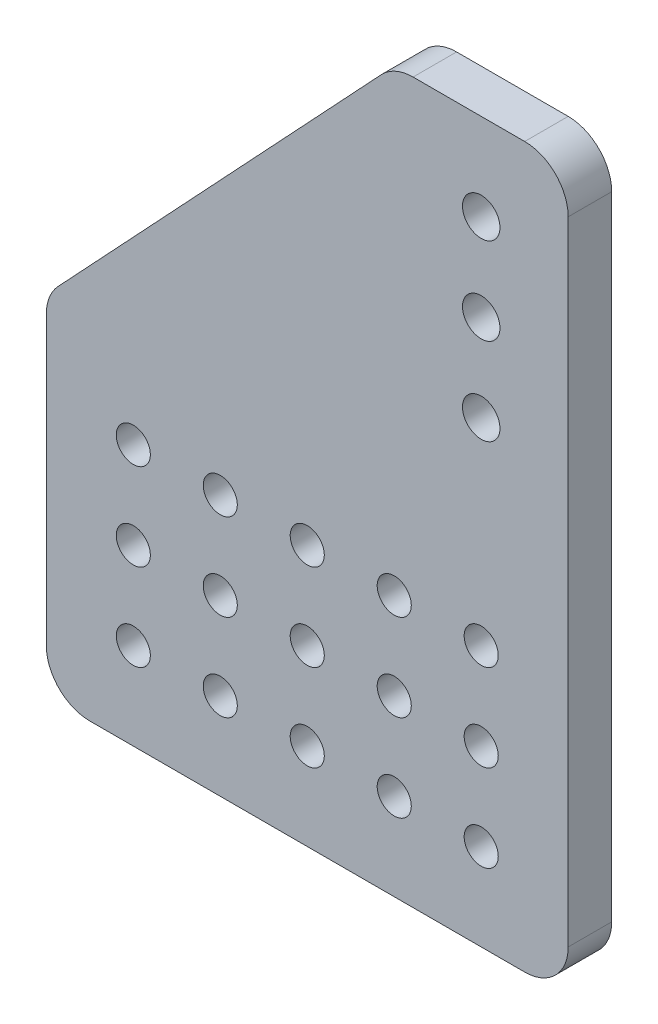
ISO-10303-21;
HEADER;
FILE_DESCRIPTION(('STEP AP214'),'2;1');
FILE_NAME('part.step','',(''),(''),'','','');
FILE_SCHEMA(('AUTOMOTIVE_DESIGN { 1 0 10303 214 1 1 1 1 }'));
ENDSEC;
DATA;
#1=APPLICATION_CONTEXT('core data for automotive mechanical design processes');
#2=APPLICATION_PROTOCOL_DEFINITION('international standard','automotive_design',2000,#1);
#3=PRODUCT_CONTEXT('',#1,'mechanical');
#4=PRODUCT('Part','Part','',(#3));
#5=PRODUCT_RELATED_PRODUCT_CATEGORY('part','',(#4));
#6=PRODUCT_DEFINITION_FORMATION('','',#4);
#7=PRODUCT_DEFINITION_CONTEXT('part definition',#1,'design');
#8=PRODUCT_DEFINITION('design','',#6,#7);
#9=PRODUCT_DEFINITION_SHAPE('','',#8);
#10=(LENGTH_UNIT() NAMED_UNIT(*) SI_UNIT(.MILLI.,.METRE.));
#11=(NAMED_UNIT(*) PLANE_ANGLE_UNIT() SI_UNIT($,.RADIAN.));
#12=(NAMED_UNIT(*) SI_UNIT($,.STERADIAN.) SOLID_ANGLE_UNIT());
#13=UNCERTAINTY_MEASURE_WITH_UNIT(LENGTH_MEASURE(1.E-05),#10,'distance_accuracy_value','');
#14=(GEOMETRIC_REPRESENTATION_CONTEXT(3) GLOBAL_UNCERTAINTY_ASSIGNED_CONTEXT((#13)) GLOBAL_UNIT_ASSIGNED_CONTEXT((#10,
#11,#12)) REPRESENTATION_CONTEXT('',''));
#15=CARTESIAN_POINT('',(0.,0.,0.));
#16=DIRECTION('',(0.,0.,1.));
#17=DIRECTION('',(1.,0.,0.));
#18=AXIS2_PLACEMENT_3D('',#15,#16,#17);
#19=CARTESIAN_POINT('',(-12.7,16.129,-3.175));
#20=DIRECTION('',(0.,0.,1.));
#21=DIRECTION('',(1.,0.,0.));
#22=AXIS2_PLACEMENT_3D('',#19,#20,#21);
#23=CYLINDRICAL_SURFACE('',#22,2.73551732453302);
#24=CARTESIAN_POINT('',(-12.7,16.129,-3.175));
#25=DIRECTION('',(0.,0.,1.));
#26=DIRECTION('',(1.,0.,0.));
#27=AXIS2_PLACEMENT_3D('',#24,#25,#26);
#28=CIRCLE('',#27,2.73551732453302);
#29=CARTESIAN_POINT('',(-9.96448267546698,16.129,-3.175));
#30=VERTEX_POINT('',#29);
#31=EDGE_CURVE('E248',#30,#30,#28,.T.);
#32=ORIENTED_EDGE('',*,*,#31,.F.);
#33=EDGE_LOOP('',(#32));
#34=FACE_BOUND('',#33,.T.);
#35=CARTESIAN_POINT('',(-12.7,16.129,3.175));
#36=DIRECTION('',(0.,0.,1.));
#37=DIRECTION('',(1.,0.,0.));
#38=AXIS2_PLACEMENT_3D('',#35,#36,#37);
#39=CIRCLE('',#38,2.73551732453302);
#40=CARTESIAN_POINT('',(-9.96448267546698,16.129,3.175));
#41=VERTEX_POINT('',#40);
#42=EDGE_CURVE('E251',#41,#41,#39,.T.);
#43=ORIENTED_EDGE('',*,*,#42,.T.);
#44=EDGE_LOOP('',(#43));
#45=FACE_BOUND('',#44,.T.);
#46=ADVANCED_FACE('F43',(#34,#45),#23,.F.);
#47=CARTESIAN_POINT('',(-12.7,28.829,-3.175));
#48=DIRECTION('',(0.,0.,1.));
#49=DIRECTION('',(1.,0.,0.));
#50=AXIS2_PLACEMENT_3D('',#47,#48,#49);
#51=CYLINDRICAL_SURFACE('',#50,2.73551732453302);
#52=CARTESIAN_POINT('',(-12.7,28.829,-3.175));
#53=DIRECTION('',(0.,0.,1.));
#54=DIRECTION('',(1.,0.,0.));
#55=AXIS2_PLACEMENT_3D('',#52,#53,#54);
#56=CIRCLE('',#55,2.73551732453302);
#57=CARTESIAN_POINT('',(-9.96448267546698,28.829,-3.175));
#58=VERTEX_POINT('',#57);
#59=EDGE_CURVE('E242',#58,#58,#56,.T.);
#60=ORIENTED_EDGE('',*,*,#59,.F.);
#61=EDGE_LOOP('',(#60));
#62=FACE_BOUND('',#61,.T.);
#63=CARTESIAN_POINT('',(-12.7,28.829,3.175));
#64=DIRECTION('',(0.,0.,1.));
#65=DIRECTION('',(1.,0.,0.));
#66=AXIS2_PLACEMENT_3D('',#63,#64,#65);
#67=CIRCLE('',#66,2.73551732453302);
#68=CARTESIAN_POINT('',(-9.96448267546698,28.829,3.175));
#69=VERTEX_POINT('',#68);
#70=EDGE_CURVE('E245',#69,#69,#67,.T.);
#71=ORIENTED_EDGE('',*,*,#70,.T.);
#72=EDGE_LOOP('',(#71));
#73=FACE_BOUND('',#72,.T.);
#74=ADVANCED_FACE('F349',(#62,#73),#51,.F.);
#75=CARTESIAN_POINT('',(-63.5,-12.7,-3.175));
#76=DIRECTION('',(0.,0.,1.));
#77=DIRECTION('',(1.,0.,0.));
#78=AXIS2_PLACEMENT_3D('',#75,#76,#77);
#79=CYLINDRICAL_SURFACE('',#78,2.4892);
#80=CARTESIAN_POINT('',(-63.5,-12.7,-3.175));
#81=DIRECTION('',(0.,0.,1.));
#82=DIRECTION('',(1.,0.,0.));
#83=AXIS2_PLACEMENT_3D('',#80,#81,#82);
#84=CIRCLE('',#83,2.4892);
#85=CARTESIAN_POINT('',(-61.0108,-12.7,-3.175));
#86=VERTEX_POINT('',#85);
#87=EDGE_CURVE('E236',#86,#86,#84,.T.);
#88=ORIENTED_EDGE('',*,*,#87,.F.);
#89=EDGE_LOOP('',(#88));
#90=FACE_BOUND('',#89,.T.);
#91=CARTESIAN_POINT('',(-63.5,-12.7,3.175));
#92=DIRECTION('',(0.,0.,1.));
#93=DIRECTION('',(1.,0.,0.));
#94=AXIS2_PLACEMENT_3D('',#91,#92,#93);
#95=CIRCLE('',#94,2.4892);
#96=CARTESIAN_POINT('',(-61.0108,-12.7,3.175));
#97=VERTEX_POINT('',#96);
#98=EDGE_CURVE('E239',#97,#97,#95,.T.);
#99=ORIENTED_EDGE('',*,*,#98,.T.);
#100=EDGE_LOOP('',(#99));
#101=FACE_BOUND('',#100,.T.);
#102=ADVANCED_FACE('F356',(#90,#101),#79,.F.);
#103=CARTESIAN_POINT('',(-50.8,-12.7,-3.175));
#104=DIRECTION('',(0.,0.,1.));
#105=DIRECTION('',(1.,0.,0.));
#106=AXIS2_PLACEMENT_3D('',#103,#104,#105);
#107=CYLINDRICAL_SURFACE('',#106,2.4892);
#108=CARTESIAN_POINT('',(-50.8,-12.7,-3.175));
#109=DIRECTION('',(0.,0.,1.));
#110=DIRECTION('',(1.,0.,0.));
#111=AXIS2_PLACEMENT_3D('',#108,#109,#110);
#112=CIRCLE('',#111,2.4892);
#113=CARTESIAN_POINT('',(-48.3108,-12.7,-3.175));
#114=VERTEX_POINT('',#113);
#115=EDGE_CURVE('E230',#114,#114,#112,.T.);
#116=ORIENTED_EDGE('',*,*,#115,.F.);
#117=EDGE_LOOP('',(#116));
#118=FACE_BOUND('',#117,.T.);
#119=CARTESIAN_POINT('',(-50.8,-12.7,3.175));
#120=DIRECTION('',(0.,0.,1.));
#121=DIRECTION('',(1.,0.,0.));
#122=AXIS2_PLACEMENT_3D('',#119,#120,#121);
#123=CIRCLE('',#122,2.4892);
#124=CARTESIAN_POINT('',(-48.3108,-12.7,3.175));
#125=VERTEX_POINT('',#124);
#126=EDGE_CURVE('E233',#125,#125,#123,.T.);
#127=ORIENTED_EDGE('',*,*,#126,.T.);
#128=EDGE_LOOP('',(#127));
#129=FACE_BOUND('',#128,.T.);
#130=ADVANCED_FACE('F443',(#118,#129),#107,.F.);
#131=CARTESIAN_POINT('',(-38.1,-12.7,-3.175));
#132=DIRECTION('',(0.,0.,1.));
#133=DIRECTION('',(1.,0.,0.));
#134=AXIS2_PLACEMENT_3D('',#131,#132,#133);
#135=CYLINDRICAL_SURFACE('',#134,2.4892);
#136=CARTESIAN_POINT('',(-38.1,-12.7,-3.175));
#137=DIRECTION('',(0.,0.,1.));
#138=DIRECTION('',(1.,0.,0.));
#139=AXIS2_PLACEMENT_3D('',#136,#137,#138);
#140=CIRCLE('',#139,2.4892);
#141=CARTESIAN_POINT('',(-35.6108,-12.7,-3.175));
#142=VERTEX_POINT('',#141);
#143=EDGE_CURVE('E224',#142,#142,#140,.T.);
#144=ORIENTED_EDGE('',*,*,#143,.F.);
#145=EDGE_LOOP('',(#144));
#146=FACE_BOUND('',#145,.T.);
#147=CARTESIAN_POINT('',(-38.1,-12.7,3.175));
#148=DIRECTION('',(0.,0.,1.));
#149=DIRECTION('',(1.,0.,0.));
#150=AXIS2_PLACEMENT_3D('',#147,#148,#149);
#151=CIRCLE('',#150,2.4892);
#152=CARTESIAN_POINT('',(-35.6108,-12.7,3.175));
#153=VERTEX_POINT('',#152);
#154=EDGE_CURVE('E227',#153,#153,#151,.T.);
#155=ORIENTED_EDGE('',*,*,#154,.T.);
#156=EDGE_LOOP('',(#155));
#157=FACE_BOUND('',#156,.T.);
#158=ADVANCED_FACE('F439',(#146,#157),#135,.F.);
#159=CARTESIAN_POINT('',(-25.4,-12.7,-3.175));
#160=DIRECTION('',(0.,0.,1.));
#161=DIRECTION('',(1.,0.,0.));
#162=AXIS2_PLACEMENT_3D('',#159,#160,#161);
#163=CYLINDRICAL_SURFACE('',#162,2.4892);
#164=CARTESIAN_POINT('',(-25.4,-12.7,-3.175));
#165=DIRECTION('',(0.,0.,1.));
#166=DIRECTION('',(1.,0.,0.));
#167=AXIS2_PLACEMENT_3D('',#164,#165,#166);
#168=CIRCLE('',#167,2.4892);
#169=CARTESIAN_POINT('',(-22.9108,-12.7,-3.175));
#170=VERTEX_POINT('',#169);
#171=EDGE_CURVE('E218',#170,#170,#168,.T.);
#172=ORIENTED_EDGE('',*,*,#171,.F.);
#173=EDGE_LOOP('',(#172));
#174=FACE_BOUND('',#173,.T.);
#175=CARTESIAN_POINT('',(-25.4,-12.7,3.175));
#176=DIRECTION('',(0.,0.,1.));
#177=DIRECTION('',(1.,0.,0.));
#178=AXIS2_PLACEMENT_3D('',#175,#176,#177);
#179=CIRCLE('',#178,2.4892);
#180=CARTESIAN_POINT('',(-22.9108,-12.7,3.175));
#181=VERTEX_POINT('',#180);
#182=EDGE_CURVE('E221',#181,#181,#179,.T.);
#183=ORIENTED_EDGE('',*,*,#182,.T.);
#184=EDGE_LOOP('',(#183));
#185=FACE_BOUND('',#184,.T.);
#186=ADVANCED_FACE('F435',(#174,#185),#163,.F.);
#187=CARTESIAN_POINT('',(-12.7,-12.7,-3.175));
#188=DIRECTION('',(0.,0.,1.));
#189=DIRECTION('',(1.,0.,0.));
#190=AXIS2_PLACEMENT_3D('',#187,#188,#189);
#191=CYLINDRICAL_SURFACE('',#190,2.4892);
#192=CARTESIAN_POINT('',(-12.7,-12.7,-3.175));
#193=DIRECTION('',(0.,0.,1.));
#194=DIRECTION('',(1.,0.,0.));
#195=AXIS2_PLACEMENT_3D('',#192,#193,#194);
#196=CIRCLE('',#195,2.4892);
#197=CARTESIAN_POINT('',(-10.2108,-12.7,-3.175));
#198=VERTEX_POINT('',#197);
#199=EDGE_CURVE('E212',#198,#198,#196,.T.);
#200=ORIENTED_EDGE('',*,*,#199,.F.);
#201=EDGE_LOOP('',(#200));
#202=FACE_BOUND('',#201,.T.);
#203=CARTESIAN_POINT('',(-12.7,-12.7,3.175));
#204=DIRECTION('',(0.,0.,1.));
#205=DIRECTION('',(1.,0.,0.));
#206=AXIS2_PLACEMENT_3D('',#203,#204,#205);
#207=CIRCLE('',#206,2.4892);
#208=CARTESIAN_POINT('',(-10.2108,-12.7,3.175));
#209=VERTEX_POINT('',#208);
#210=EDGE_CURVE('E215',#209,#209,#207,.T.);
#211=ORIENTED_EDGE('',*,*,#210,.T.);
#212=EDGE_LOOP('',(#211));
#213=FACE_BOUND('',#212,.T.);
#214=ADVANCED_FACE('F431',(#202,#213),#191,.F.);
#215=CARTESIAN_POINT('',(-63.5,-25.4,-3.175));
#216=DIRECTION('',(0.,0.,1.));
#217=DIRECTION('',(1.,0.,0.));
#218=AXIS2_PLACEMENT_3D('',#215,#216,#217);
#219=CYLINDRICAL_SURFACE('',#218,2.4892);
#220=CARTESIAN_POINT('',(-63.5,-25.4,-3.175));
#221=DIRECTION('',(0.,0.,1.));
#222=DIRECTION('',(1.,0.,0.));
#223=AXIS2_PLACEMENT_3D('',#220,#221,#222);
#224=CIRCLE('',#223,2.4892);
#225=CARTESIAN_POINT('',(-61.0108,-25.4,-3.175));
#226=VERTEX_POINT('',#225);
#227=EDGE_CURVE('E206',#226,#226,#224,.T.);
#228=ORIENTED_EDGE('',*,*,#227,.F.);
#229=EDGE_LOOP('',(#228));
#230=FACE_BOUND('',#229,.T.);
#231=CARTESIAN_POINT('',(-63.5,-25.4,3.175));
#232=DIRECTION('',(0.,0.,1.));
#233=DIRECTION('',(1.,0.,0.));
#234=AXIS2_PLACEMENT_3D('',#231,#232,#233);
#235=CIRCLE('',#234,2.4892);
#236=CARTESIAN_POINT('',(-61.0108,-25.4,3.175));
#237=VERTEX_POINT('',#236);
#238=EDGE_CURVE('E209',#237,#237,#235,.T.);
#239=ORIENTED_EDGE('',*,*,#238,.T.);
#240=EDGE_LOOP('',(#239));
#241=FACE_BOUND('',#240,.T.);
#242=ADVANCED_FACE('F427',(#230,#241),#219,.F.);
#243=CARTESIAN_POINT('',(-50.8,-25.4,-3.175));
#244=DIRECTION('',(0.,0.,1.));
#245=DIRECTION('',(1.,0.,0.));
#246=AXIS2_PLACEMENT_3D('',#243,#244,#245);
#247=CYLINDRICAL_SURFACE('',#246,2.4892);
#248=CARTESIAN_POINT('',(-50.8,-25.4,-3.175));
#249=DIRECTION('',(0.,0.,1.));
#250=DIRECTION('',(1.,0.,0.));
#251=AXIS2_PLACEMENT_3D('',#248,#249,#250);
#252=CIRCLE('',#251,2.4892);
#253=CARTESIAN_POINT('',(-48.3108,-25.4,-3.175));
#254=VERTEX_POINT('',#253);
#255=EDGE_CURVE('E200',#254,#254,#252,.T.);
#256=ORIENTED_EDGE('',*,*,#255,.F.);
#257=EDGE_LOOP('',(#256));
#258=FACE_BOUND('',#257,.T.);
#259=CARTESIAN_POINT('',(-50.8,-25.4,3.175));
#260=DIRECTION('',(0.,0.,1.));
#261=DIRECTION('',(1.,0.,0.));
#262=AXIS2_PLACEMENT_3D('',#259,#260,#261);
#263=CIRCLE('',#262,2.4892);
#264=CARTESIAN_POINT('',(-48.3108,-25.4,3.175));
#265=VERTEX_POINT('',#264);
#266=EDGE_CURVE('E203',#265,#265,#263,.T.);
#267=ORIENTED_EDGE('',*,*,#266,.T.);
#268=EDGE_LOOP('',(#267));
#269=FACE_BOUND('',#268,.T.);
#270=ADVANCED_FACE('F423',(#258,#269),#247,.F.);
#271=CARTESIAN_POINT('',(-38.1,-25.4,-3.175));
#272=DIRECTION('',(0.,0.,1.));
#273=DIRECTION('',(1.,0.,0.));
#274=AXIS2_PLACEMENT_3D('',#271,#272,#273);
#275=CYLINDRICAL_SURFACE('',#274,2.4892);
#276=CARTESIAN_POINT('',(-38.1,-25.4,-3.175));
#277=DIRECTION('',(0.,0.,1.));
#278=DIRECTION('',(1.,0.,0.));
#279=AXIS2_PLACEMENT_3D('',#276,#277,#278);
#280=CIRCLE('',#279,2.4892);
#281=CARTESIAN_POINT('',(-35.6108,-25.4,-3.175));
#282=VERTEX_POINT('',#281);
#283=EDGE_CURVE('E194',#282,#282,#280,.T.);
#284=ORIENTED_EDGE('',*,*,#283,.F.);
#285=EDGE_LOOP('',(#284));
#286=FACE_BOUND('',#285,.T.);
#287=CARTESIAN_POINT('',(-38.1,-25.4,3.175));
#288=DIRECTION('',(0.,0.,1.));
#289=DIRECTION('',(1.,0.,0.));
#290=AXIS2_PLACEMENT_3D('',#287,#288,#289);
#291=CIRCLE('',#290,2.4892);
#292=CARTESIAN_POINT('',(-35.6108,-25.4,3.175));
#293=VERTEX_POINT('',#292);
#294=EDGE_CURVE('E197',#293,#293,#291,.T.);
#295=ORIENTED_EDGE('',*,*,#294,.T.);
#296=EDGE_LOOP('',(#295));
#297=FACE_BOUND('',#296,.T.);
#298=ADVANCED_FACE('F419',(#286,#297),#275,.F.);
#299=CARTESIAN_POINT('',(-25.4,-25.4,-3.175));
#300=DIRECTION('',(0.,0.,1.));
#301=DIRECTION('',(1.,0.,0.));
#302=AXIS2_PLACEMENT_3D('',#299,#300,#301);
#303=CYLINDRICAL_SURFACE('',#302,2.4892);
#304=CARTESIAN_POINT('',(-25.4,-25.4,-3.175));
#305=DIRECTION('',(0.,0.,1.));
#306=DIRECTION('',(1.,0.,0.));
#307=AXIS2_PLACEMENT_3D('',#304,#305,#306);
#308=CIRCLE('',#307,2.4892);
#309=CARTESIAN_POINT('',(-22.9108,-25.4,-3.175));
#310=VERTEX_POINT('',#309);
#311=EDGE_CURVE('E188',#310,#310,#308,.T.);
#312=ORIENTED_EDGE('',*,*,#311,.F.);
#313=EDGE_LOOP('',(#312));
#314=FACE_BOUND('',#313,.T.);
#315=CARTESIAN_POINT('',(-25.4,-25.4,3.175));
#316=DIRECTION('',(0.,0.,1.));
#317=DIRECTION('',(1.,0.,0.));
#318=AXIS2_PLACEMENT_3D('',#315,#316,#317);
#319=CIRCLE('',#318,2.4892);
#320=CARTESIAN_POINT('',(-22.9108,-25.4,3.175));
#321=VERTEX_POINT('',#320);
#322=EDGE_CURVE('E191',#321,#321,#319,.T.);
#323=ORIENTED_EDGE('',*,*,#322,.T.);
#324=EDGE_LOOP('',(#323));
#325=FACE_BOUND('',#324,.T.);
#326=ADVANCED_FACE('F415',(#314,#325),#303,.F.);
#327=CARTESIAN_POINT('',(-12.7,-25.4,-3.175));
#328=DIRECTION('',(0.,0.,1.));
#329=DIRECTION('',(1.,0.,0.));
#330=AXIS2_PLACEMENT_3D('',#327,#328,#329);
#331=CYLINDRICAL_SURFACE('',#330,2.4892);
#332=CARTESIAN_POINT('',(-12.7,-25.4,-3.175));
#333=DIRECTION('',(0.,0.,1.));
#334=DIRECTION('',(1.,0.,0.));
#335=AXIS2_PLACEMENT_3D('',#332,#333,#334);
#336=CIRCLE('',#335,2.4892);
#337=CARTESIAN_POINT('',(-10.2108,-25.4,-3.175));
#338=VERTEX_POINT('',#337);
#339=EDGE_CURVE('E182',#338,#338,#336,.T.);
#340=ORIENTED_EDGE('',*,*,#339,.F.);
#341=EDGE_LOOP('',(#340));
#342=FACE_BOUND('',#341,.T.);
#343=CARTESIAN_POINT('',(-12.7,-25.4,3.175));
#344=DIRECTION('',(0.,0.,1.));
#345=DIRECTION('',(1.,0.,0.));
#346=AXIS2_PLACEMENT_3D('',#343,#344,#345);
#347=CIRCLE('',#346,2.4892);
#348=CARTESIAN_POINT('',(-10.2108,-25.4,3.175));
#349=VERTEX_POINT('',#348);
#350=EDGE_CURVE('E185',#349,#349,#347,.T.);
#351=ORIENTED_EDGE('',*,*,#350,.T.);
#352=EDGE_LOOP('',(#351));
#353=FACE_BOUND('',#352,.T.);
#354=ADVANCED_FACE('F411',(#342,#353),#331,.F.);
#355=CARTESIAN_POINT('',(-63.5,-38.1,-3.175));
#356=DIRECTION('',(0.,0.,1.));
#357=DIRECTION('',(1.,0.,0.));
#358=AXIS2_PLACEMENT_3D('',#355,#356,#357);
#359=CYLINDRICAL_SURFACE('',#358,2.4892);
#360=CARTESIAN_POINT('',(-63.5,-38.1,-3.175));
#361=DIRECTION('',(0.,0.,1.));
#362=DIRECTION('',(1.,0.,0.));
#363=AXIS2_PLACEMENT_3D('',#360,#361,#362);
#364=CIRCLE('',#363,2.4892);
#365=CARTESIAN_POINT('',(-61.0108,-38.1,-3.175));
#366=VERTEX_POINT('',#365);
#367=EDGE_CURVE('E176',#366,#366,#364,.T.);
#368=ORIENTED_EDGE('',*,*,#367,.F.);
#369=EDGE_LOOP('',(#368));
#370=FACE_BOUND('',#369,.T.);
#371=CARTESIAN_POINT('',(-63.5,-38.1,3.175));
#372=DIRECTION('',(0.,0.,1.));
#373=DIRECTION('',(1.,0.,0.));
#374=AXIS2_PLACEMENT_3D('',#371,#372,#373);
#375=CIRCLE('',#374,2.4892);
#376=CARTESIAN_POINT('',(-61.0108,-38.1,3.175));
#377=VERTEX_POINT('',#376);
#378=EDGE_CURVE('E179',#377,#377,#375,.T.);
#379=ORIENTED_EDGE('',*,*,#378,.T.);
#380=EDGE_LOOP('',(#379));
#381=FACE_BOUND('',#380,.T.);
#382=ADVANCED_FACE('F407',(#370,#381),#359,.F.);
#383=CARTESIAN_POINT('',(-50.8,-38.1,-3.175));
#384=DIRECTION('',(0.,0.,1.));
#385=DIRECTION('',(1.,0.,0.));
#386=AXIS2_PLACEMENT_3D('',#383,#384,#385);
#387=CYLINDRICAL_SURFACE('',#386,2.4892);
#388=CARTESIAN_POINT('',(-50.8,-38.1,-3.175));
#389=DIRECTION('',(0.,0.,1.));
#390=DIRECTION('',(1.,0.,0.));
#391=AXIS2_PLACEMENT_3D('',#388,#389,#390);
#392=CIRCLE('',#391,2.4892);
#393=CARTESIAN_POINT('',(-48.3108,-38.1,-3.175));
#394=VERTEX_POINT('',#393);
#395=EDGE_CURVE('E170',#394,#394,#392,.T.);
#396=ORIENTED_EDGE('',*,*,#395,.F.);
#397=EDGE_LOOP('',(#396));
#398=FACE_BOUND('',#397,.T.);
#399=CARTESIAN_POINT('',(-50.8,-38.1,3.175));
#400=DIRECTION('',(0.,0.,1.));
#401=DIRECTION('',(1.,0.,0.));
#402=AXIS2_PLACEMENT_3D('',#399,#400,#401);
#403=CIRCLE('',#402,2.4892);
#404=CARTESIAN_POINT('',(-48.3108,-38.1,3.175));
#405=VERTEX_POINT('',#404);
#406=EDGE_CURVE('E173',#405,#405,#403,.T.);
#407=ORIENTED_EDGE('',*,*,#406,.T.);
#408=EDGE_LOOP('',(#407));
#409=FACE_BOUND('',#408,.T.);
#410=ADVANCED_FACE('F403',(#398,#409),#387,.F.);
#411=CARTESIAN_POINT('',(-38.1,-38.1,-3.175));
#412=DIRECTION('',(0.,0.,1.));
#413=DIRECTION('',(1.,0.,0.));
#414=AXIS2_PLACEMENT_3D('',#411,#412,#413);
#415=CYLINDRICAL_SURFACE('',#414,2.4892);
#416=CARTESIAN_POINT('',(-38.1,-38.1,-3.175));
#417=DIRECTION('',(0.,0.,1.));
#418=DIRECTION('',(1.,0.,0.));
#419=AXIS2_PLACEMENT_3D('',#416,#417,#418);
#420=CIRCLE('',#419,2.4892);
#421=CARTESIAN_POINT('',(-35.6108,-38.1,-3.175));
#422=VERTEX_POINT('',#421);
#423=EDGE_CURVE('E164',#422,#422,#420,.T.);
#424=ORIENTED_EDGE('',*,*,#423,.F.);
#425=EDGE_LOOP('',(#424));
#426=FACE_BOUND('',#425,.T.);
#427=CARTESIAN_POINT('',(-38.1,-38.1,3.175));
#428=DIRECTION('',(0.,0.,1.));
#429=DIRECTION('',(1.,0.,0.));
#430=AXIS2_PLACEMENT_3D('',#427,#428,#429);
#431=CIRCLE('',#430,2.4892);
#432=CARTESIAN_POINT('',(-35.6108,-38.1,3.175));
#433=VERTEX_POINT('',#432);
#434=EDGE_CURVE('E167',#433,#433,#431,.T.);
#435=ORIENTED_EDGE('',*,*,#434,.T.);
#436=EDGE_LOOP('',(#435));
#437=FACE_BOUND('',#436,.T.);
#438=ADVANCED_FACE('F399',(#426,#437),#415,.F.);
#439=CARTESIAN_POINT('',(-25.4,-38.1,-3.175));
#440=DIRECTION('',(0.,0.,1.));
#441=DIRECTION('',(1.,0.,0.));
#442=AXIS2_PLACEMENT_3D('',#439,#440,#441);
#443=CYLINDRICAL_SURFACE('',#442,2.4892);
#444=CARTESIAN_POINT('',(-25.4,-38.1,-3.175));
#445=DIRECTION('',(0.,0.,1.));
#446=DIRECTION('',(1.,0.,0.));
#447=AXIS2_PLACEMENT_3D('',#444,#445,#446);
#448=CIRCLE('',#447,2.4892);
#449=CARTESIAN_POINT('',(-22.9108,-38.1,-3.175));
#450=VERTEX_POINT('',#449);
#451=EDGE_CURVE('E157',#450,#450,#448,.T.);
#452=ORIENTED_EDGE('',*,*,#451,.F.);
#453=EDGE_LOOP('',(#452));
#454=FACE_BOUND('',#453,.T.);
#455=CARTESIAN_POINT('',(-25.4,-38.1,3.175));
#456=DIRECTION('',(0.,0.,1.));
#457=DIRECTION('',(1.,0.,0.));
#458=AXIS2_PLACEMENT_3D('',#455,#456,#457);
#459=CIRCLE('',#458,2.4892);
#460=CARTESIAN_POINT('',(-22.9108,-38.1,3.175));
#461=VERTEX_POINT('',#460);
#462=EDGE_CURVE('E160',#461,#461,#459,.T.);
#463=ORIENTED_EDGE('',*,*,#462,.T.);
#464=EDGE_LOOP('',(#463));
#465=FACE_BOUND('',#464,.T.);
#466=ADVANCED_FACE('F397',(#454,#465),#443,.F.);
#467=CARTESIAN_POINT('',(0.,54.229,3.175));
#468=DIRECTION('',(0.,-1.,0.));
#469=DIRECTION('',(1.,0.,0.));
#470=AXIS2_PLACEMENT_3D('',#467,#468,#469);
#471=PLANE('',#470);
#472=DIRECTION('',(-1.,0.,0.));
#473=VECTOR('',#472,1.);
#474=CARTESIAN_POINT('',(0.,54.229,3.175));
#475=LINE('',#474,#473);
#476=CARTESIAN_POINT('',(-6.35,54.229,3.175));
#477=VERTEX_POINT('',#476);
#478=CARTESIAN_POINT('',(-22.6475072562806,54.229,3.175));
#479=VERTEX_POINT('',#478);
#480=EDGE_CURVE('E151',#477,#479,#475,.T.);
#481=ORIENTED_EDGE('',*,*,#480,.F.);
#482=DIRECTION('',(0.,0.,-1.));
#483=VECTOR('',#482,1.);
#484=CARTESIAN_POINT('',(-6.35,54.229,3.175));
#485=LINE('',#484,#483);
#486=CARTESIAN_POINT('',(-6.35,54.229,-3.175));
#487=VERTEX_POINT('',#486);
#488=EDGE_CURVE('E11',#477,#487,#485,.T.);
#489=ORIENTED_EDGE('',*,*,#488,.T.);
#490=DIRECTION('',(-1.,0.,0.));
#491=VECTOR('',#490,1.);
#492=CARTESIAN_POINT('',(0.,54.229,-3.175));
#493=LINE('',#492,#491);
#494=CARTESIAN_POINT('',(-22.6475072562806,54.229,-3.175));
#495=VERTEX_POINT('',#494);
#496=EDGE_CURVE('E287',#487,#495,#493,.T.);
#497=ORIENTED_EDGE('',*,*,#496,.T.);
#498=DIRECTION('',(0.,0.,-1.));
#499=VECTOR('',#498,1.);
#500=CARTESIAN_POINT('',(-22.6475072562806,54.229,3.175));
#501=LINE('',#500,#499);
#502=EDGE_CURVE('E51',#495,#479,#501,.F.);
#503=ORIENTED_EDGE('',*,*,#502,.T.);
#504=EDGE_LOOP('',(#481,#489,#497,#503));
#505=FACE_BOUND('',#504,.T.);
#506=ADVANCED_FACE('F285',(#505),#471,.F.);
#507=CARTESIAN_POINT('',(-76.2,0.,3.175));
#508=DIRECTION('',(0.72980364699567,-0.68365681217393,0.));
#509=DIRECTION('',(0.68365681217393,0.72980364699567,0.));
#510=AXIS2_PLACEMENT_3D('',#507,#508,#509);
#511=PLANE('',#510);
#512=DIRECTION('',(-0.68365681217393,-0.72980364699567,0.));
#513=VECTOR('',#512,1.);
#514=CARTESIAN_POINT('',(-76.2,0.,-3.175));
#515=LINE('',#514,#513);
#516=CARTESIAN_POINT('',(-27.2817604147031,52.2202207573045,-3.175));
#517=VERTEX_POINT('',#516);
#518=CARTESIAN_POINT('',(-74.4842531584225,1.83155975338396,-3.175));
#519=VERTEX_POINT('',#518);
#520=EDGE_CURVE('E301',#517,#519,#515,.T.);
#521=ORIENTED_EDGE('',*,*,#520,.T.);
#522=DIRECTION('',(0.,0.,-1.));
#523=VECTOR('',#522,1.);
#524=CARTESIAN_POINT('',(-74.4842531584225,1.83155975338396,3.175));
#525=LINE('',#524,#523);
#526=CARTESIAN_POINT('',(-74.4842531584225,1.83155975338396,3.175));
#527=VERTEX_POINT('',#526);
#528=EDGE_CURVE('E279',#519,#527,#525,.F.);
#529=ORIENTED_EDGE('',*,*,#528,.T.);
#530=DIRECTION('',(-0.68365681217393,-0.72980364699567,0.));
#531=VECTOR('',#530,1.);
#532=CARTESIAN_POINT('',(-76.2,0.,3.175));
#533=LINE('',#532,#531);
#534=CARTESIAN_POINT('',(-27.2817604147031,52.2202207573045,3.175));
#535=VERTEX_POINT('',#534);
#536=EDGE_CURVE('E294',#535,#527,#533,.T.);
#537=ORIENTED_EDGE('',*,*,#536,.F.);
#538=DIRECTION('',(0.,0.,-1.));
#539=VECTOR('',#538,1.);
#540=CARTESIAN_POINT('',(-27.2817604147031,52.2202207573045,3.175));
#541=LINE('',#540,#539);
#542=EDGE_CURVE('E276',#535,#517,#541,.T.);
#543=ORIENTED_EDGE('',*,*,#542,.T.);
#544=EDGE_LOOP('',(#521,#529,#537,#543));
#545=FACE_BOUND('',#544,.T.);
#546=ADVANCED_FACE('F300',(#545),#511,.F.);
#547=CARTESIAN_POINT('',(-76.2,0.,3.175));
#548=DIRECTION('',(1.,0.,0.));
#549=DIRECTION('',(0.,1.,0.));
#550=AXIS2_PLACEMENT_3D('',#547,#548,#549);
#551=PLANE('',#550);
#552=DIRECTION('',(0.,-1.,0.));
#553=VECTOR('',#552,1.);
#554=CARTESIAN_POINT('',(-76.2,0.,-3.175));
#555=LINE('',#554,#553);
#556=CARTESIAN_POINT('',(-76.2,-2.50966100392049,-3.175));
#557=VERTEX_POINT('',#556);
#558=CARTESIAN_POINT('',(-76.2,-44.45,-3.175));
#559=VERTEX_POINT('',#558);
#560=EDGE_CURVE('E153',#557,#559,#555,.T.);
#561=ORIENTED_EDGE('',*,*,#560,.T.);
#562=DIRECTION('',(0.,0.,-1.));
#563=VECTOR('',#562,1.);
#564=CARTESIAN_POINT('',(-76.2,-44.45,3.175));
#565=LINE('',#564,#563);
#566=CARTESIAN_POINT('',(-76.2,-44.45,3.175));
#567=VERTEX_POINT('',#566);
#568=EDGE_CURVE('E58',#559,#567,#565,.F.);
#569=ORIENTED_EDGE('',*,*,#568,.T.);
#570=DIRECTION('',(0.,-1.,0.));
#571=VECTOR('',#570,1.);
#572=CARTESIAN_POINT('',(-76.2,0.,3.175));
#573=LINE('',#572,#571);
#574=CARTESIAN_POINT('',(-76.2,-2.50966100392049,3.175));
#575=VERTEX_POINT('',#574);
#576=EDGE_CURVE('E309',#575,#567,#573,.T.);
#577=ORIENTED_EDGE('',*,*,#576,.F.);
#578=DIRECTION('',(0.,0.,-1.));
#579=VECTOR('',#578,1.);
#580=CARTESIAN_POINT('',(-76.2,-2.50966100392049,3.175));
#581=LINE('',#580,#579);
#582=EDGE_CURVE('E272',#575,#557,#581,.T.);
#583=ORIENTED_EDGE('',*,*,#582,.T.);
#584=EDGE_LOOP('',(#561,#569,#577,#583));
#585=FACE_BOUND('',#584,.T.);
#586=ADVANCED_FACE('F383',(#585),#551,.F.);
#587=CARTESIAN_POINT('',(0.,-50.8,3.175));
#588=DIRECTION('',(0.,1.,0.));
#589=DIRECTION('',(-1.,0.,0.));
#590=AXIS2_PLACEMENT_3D('',#587,#588,#589);
#591=PLANE('',#590);
#592=DIRECTION('',(1.,0.,0.));
#593=VECTOR('',#592,1.);
#594=CARTESIAN_POINT('',(0.,-50.8,-3.175));
#595=LINE('',#594,#593);
#596=CARTESIAN_POINT('',(-69.85,-50.8,-3.175));
#597=VERTEX_POINT('',#596);
#598=CARTESIAN_POINT('',(-6.35,-50.8,-3.175));
#599=VERTEX_POINT('',#598);
#600=EDGE_CURVE('E149',#597,#599,#595,.T.);
#601=ORIENTED_EDGE('',*,*,#600,.T.);
#602=DIRECTION('',(0.,0.,-1.));
#603=VECTOR('',#602,1.);
#604=CARTESIAN_POINT('',(-6.35,-50.8,3.175));
#605=LINE('',#604,#603);
#606=CARTESIAN_POINT('',(-6.35,-50.8,3.175));
#607=VERTEX_POINT('',#606);
#608=EDGE_CURVE('E127',#599,#607,#605,.F.);
#609=ORIENTED_EDGE('',*,*,#608,.T.);
#610=DIRECTION('',(1.,0.,0.));
#611=VECTOR('',#610,1.);
#612=CARTESIAN_POINT('',(0.,-50.8,3.175));
#613=LINE('',#612,#611);
#614=CARTESIAN_POINT('',(-69.85,-50.8,3.175));
#615=VERTEX_POINT('',#614);
#616=EDGE_CURVE('E161',#615,#607,#613,.T.);
#617=ORIENTED_EDGE('',*,*,#616,.F.);
#618=DIRECTION('',(0.,0.,-1.));
#619=VECTOR('',#618,1.);
#620=CARTESIAN_POINT('',(-69.85,-50.8,3.175));
#621=LINE('',#620,#619);
#622=EDGE_CURVE('E132',#615,#597,#621,.T.);
#623=ORIENTED_EDGE('',*,*,#622,.T.);
#624=EDGE_LOOP('',(#601,#609,#617,#623));
#625=FACE_BOUND('',#624,.T.);
#626=ADVANCED_FACE('F382',(#625),#591,.F.);
#627=CARTESIAN_POINT('',(0.,0.,3.175));
#628=DIRECTION('',(-1.,0.,0.));
#629=DIRECTION('',(0.,0.,1.));
#630=AXIS2_PLACEMENT_3D('',#627,#628,#629);
#631=PLANE('',#630);
#632=DIRECTION('',(0.,1.,0.));
#633=VECTOR('',#632,1.);
#634=CARTESIAN_POINT('',(0.,3.429,3.175));
#635=LINE('',#634,#633);
#636=CARTESIAN_POINT('',(0.,-44.45,3.175));
#637=VERTEX_POINT('',#636);
#638=CARTESIAN_POINT('',(0.,47.879,3.175));
#639=VERTEX_POINT('',#638);
#640=EDGE_CURVE('E142',#637,#639,#635,.T.);
#641=ORIENTED_EDGE('',*,*,#640,.F.);
#642=DIRECTION('',(0.,0.,-1.));
#643=VECTOR('',#642,1.);
#644=CARTESIAN_POINT('',(0.,-44.45,3.175));
#645=LINE('',#644,#643);
#646=CARTESIAN_POINT('',(0.,-44.45,-3.175));
#647=VERTEX_POINT('',#646);
#648=EDGE_CURVE('E126',#637,#647,#645,.T.);
#649=ORIENTED_EDGE('',*,*,#648,.T.);
#650=DIRECTION('',(0.,1.,0.));
#651=VECTOR('',#650,1.);
#652=CARTESIAN_POINT('',(0.,0.,-3.175));
#653=LINE('',#652,#651);
#654=CARTESIAN_POINT('',(0.,47.879,-3.175));
#655=VERTEX_POINT('',#654);
#656=EDGE_CURVE('E139',#647,#655,#653,.T.);
#657=ORIENTED_EDGE('',*,*,#656,.T.);
#658=DIRECTION('',(0.,0.,-1.));
#659=VECTOR('',#658,1.);
#660=CARTESIAN_POINT('',(0.,47.879,3.175));
#661=LINE('',#660,#659);
#662=EDGE_CURVE('E144',#655,#639,#661,.F.);
#663=ORIENTED_EDGE('',*,*,#662,.T.);
#664=EDGE_LOOP('',(#641,#649,#657,#663));
#665=FACE_BOUND('',#664,.T.);
#666=ADVANCED_FACE('F138',(#665),#631,.F.);
#667=CARTESIAN_POINT('',(0.,0.,3.175));
#668=DIRECTION('',(0.,0.,-1.));
#669=DIRECTION('',(-1.,0.,0.));
#670=AXIS2_PLACEMENT_3D('',#667,#668,#669);
#671=PLANE('',#670);
#672=ORIENTED_EDGE('',*,*,#42,.F.);
#673=EDGE_LOOP('',(#672));
#674=FACE_BOUND('',#673,.T.);
#675=ORIENTED_EDGE('',*,*,#70,.F.);
#676=EDGE_LOOP('',(#675));
#677=FACE_BOUND('',#676,.T.);
#678=ORIENTED_EDGE('',*,*,#98,.F.);
#679=EDGE_LOOP('',(#678));
#680=FACE_BOUND('',#679,.T.);
#681=ORIENTED_EDGE('',*,*,#126,.F.);
#682=EDGE_LOOP('',(#681));
#683=FACE_BOUND('',#682,.T.);
#684=ORIENTED_EDGE('',*,*,#154,.F.);
#685=EDGE_LOOP('',(#684));
#686=FACE_BOUND('',#685,.T.);
#687=ORIENTED_EDGE('',*,*,#182,.F.);
#688=EDGE_LOOP('',(#687));
#689=FACE_BOUND('',#688,.T.);
#690=ORIENTED_EDGE('',*,*,#210,.F.);
#691=EDGE_LOOP('',(#690));
#692=FACE_BOUND('',#691,.T.);
#693=ORIENTED_EDGE('',*,*,#238,.F.);
#694=EDGE_LOOP('',(#693));
#695=FACE_BOUND('',#694,.T.);
#696=ORIENTED_EDGE('',*,*,#266,.F.);
#697=EDGE_LOOP('',(#696));
#698=FACE_BOUND('',#697,.T.);
#699=ORIENTED_EDGE('',*,*,#294,.F.);
#700=EDGE_LOOP('',(#699));
#701=FACE_BOUND('',#700,.T.);
#702=ORIENTED_EDGE('',*,*,#322,.F.);
#703=EDGE_LOOP('',(#702));
#704=FACE_BOUND('',#703,.T.);
#705=ORIENTED_EDGE('',*,*,#350,.F.);
#706=EDGE_LOOP('',(#705));
#707=FACE_BOUND('',#706,.T.);
#708=ORIENTED_EDGE('',*,*,#378,.F.);
#709=EDGE_LOOP('',(#708));
#710=FACE_BOUND('',#709,.T.);
#711=ORIENTED_EDGE('',*,*,#406,.F.);
#712=EDGE_LOOP('',(#711));
#713=FACE_BOUND('',#712,.T.);
#714=ORIENTED_EDGE('',*,*,#434,.F.);
#715=EDGE_LOOP('',(#714));
#716=FACE_BOUND('',#715,.T.);
#717=ORIENTED_EDGE('',*,*,#462,.F.);
#718=EDGE_LOOP('',(#717));
#719=FACE_BOUND('',#718,.T.);
#720=CARTESIAN_POINT('',(-12.7,-38.1,3.175));
#721=DIRECTION('',(0.,0.,1.));
#722=DIRECTION('',(1.,0.,0.));
#723=AXIS2_PLACEMENT_3D('',#720,#721,#722);
#724=CIRCLE('',#723,2.4892);
#725=CARTESIAN_POINT('',(-10.2108,-38.1,3.175));
#726=VERTEX_POINT('',#725);
#727=EDGE_CURVE('E318',#726,#726,#724,.T.);
#728=ORIENTED_EDGE('',*,*,#727,.F.);
#729=EDGE_LOOP('',(#728));
#730=FACE_BOUND('',#729,.T.);
#731=CARTESIAN_POINT('',(-12.7,41.529,3.175));
#732=DIRECTION('',(0.,0.,1.));
#733=DIRECTION('',(1.,0.,0.));
#734=AXIS2_PLACEMENT_3D('',#731,#732,#733);
#735=CIRCLE('',#734,2.73551732453302);
#736=CARTESIAN_POINT('',(-9.96448267546698,41.529,3.175));
#737=VERTEX_POINT('',#736);
#738=EDGE_CURVE('E315',#737,#737,#735,.T.);
#739=ORIENTED_EDGE('',*,*,#738,.F.);
#740=EDGE_LOOP('',(#739));
#741=FACE_BOUND('',#740,.T.);
#742=ORIENTED_EDGE('',*,*,#616,.T.);
#743=CARTESIAN_POINT('',(-6.35,-44.45,3.175));
#744=DIRECTION('',(0.,0.,-1.));
#745=DIRECTION('',(-1.,0.,0.));
#746=AXIS2_PLACEMENT_3D('',#743,#744,#745);
#747=CIRCLE('',#746,6.35);
#748=EDGE_CURVE('E270',#607,#637,#747,.F.);
#749=ORIENTED_EDGE('',*,*,#748,.T.);
#750=ORIENTED_EDGE('',*,*,#640,.T.);
#751=CARTESIAN_POINT('',(-6.35,47.879,3.175));
#752=DIRECTION('',(0.,0.,-1.));
#753=DIRECTION('',(-1.,0.,0.));
#754=AXIS2_PLACEMENT_3D('',#751,#752,#753);
#755=CIRCLE('',#754,6.35);
#756=EDGE_CURVE('E265',#639,#477,#755,.F.);
#757=ORIENTED_EDGE('',*,*,#756,.T.);
#758=ORIENTED_EDGE('',*,*,#480,.T.);
#759=CARTESIAN_POINT('',(-22.6475072562806,47.879,3.175));
#760=DIRECTION('',(0.,0.,-1.));
#761=DIRECTION('',(-1.,0.,0.));
#762=AXIS2_PLACEMENT_3D('',#759,#760,#761);
#763=CIRCLE('',#762,6.35);
#764=EDGE_CURVE('E263',#479,#535,#763,.F.);
#765=ORIENTED_EDGE('',*,*,#764,.T.);
#766=ORIENTED_EDGE('',*,*,#536,.T.);
#767=CARTESIAN_POINT('',(-69.85,-2.50966100392049,3.175));
#768=DIRECTION('',(0.,0.,-1.));
#769=DIRECTION('',(-1.,0.,0.));
#770=AXIS2_PLACEMENT_3D('',#767,#768,#769);
#771=CIRCLE('',#770,6.35);
#772=EDGE_CURVE('E65',#527,#575,#771,.F.);
#773=ORIENTED_EDGE('',*,*,#772,.T.);
#774=ORIENTED_EDGE('',*,*,#576,.T.);
#775=CARTESIAN_POINT('',(-69.85,-44.45,3.175));
#776=DIRECTION('',(0.,0.,-1.));
#777=DIRECTION('',(-1.,0.,0.));
#778=AXIS2_PLACEMENT_3D('',#775,#776,#777);
#779=CIRCLE('',#778,6.35);
#780=EDGE_CURVE('E268',#567,#615,#779,.F.);
#781=ORIENTED_EDGE('',*,*,#780,.T.);
#782=EDGE_LOOP('',(#742,#749,#750,#757,#758,#765,#766,#773,#774,#781));
#783=FACE_BOUND('',#782,.T.);
#784=ADVANCED_FACE('F291',(#674,#677,#680,#683,#686,#689,#692,#695,#698,#701,#704,#707,#710,
#713,#716,#719,#730,#741,#783),#671,.F.);
#785=CARTESIAN_POINT('',(0.,0.,-3.175));
#786=DIRECTION('',(0.,0.,-1.));
#787=DIRECTION('',(-1.,0.,0.));
#788=AXIS2_PLACEMENT_3D('',#785,#786,#787);
#789=PLANE('',#788);
#790=ORIENTED_EDGE('',*,*,#31,.T.);
#791=EDGE_LOOP('',(#790));
#792=FACE_BOUND('',#791,.T.);
#793=ORIENTED_EDGE('',*,*,#59,.T.);
#794=EDGE_LOOP('',(#793));
#795=FACE_BOUND('',#794,.T.);
#796=ORIENTED_EDGE('',*,*,#87,.T.);
#797=EDGE_LOOP('',(#796));
#798=FACE_BOUND('',#797,.T.);
#799=ORIENTED_EDGE('',*,*,#115,.T.);
#800=EDGE_LOOP('',(#799));
#801=FACE_BOUND('',#800,.T.);
#802=ORIENTED_EDGE('',*,*,#143,.T.);
#803=EDGE_LOOP('',(#802));
#804=FACE_BOUND('',#803,.T.);
#805=ORIENTED_EDGE('',*,*,#171,.T.);
#806=EDGE_LOOP('',(#805));
#807=FACE_BOUND('',#806,.T.);
#808=ORIENTED_EDGE('',*,*,#199,.T.);
#809=EDGE_LOOP('',(#808));
#810=FACE_BOUND('',#809,.T.);
#811=ORIENTED_EDGE('',*,*,#227,.T.);
#812=EDGE_LOOP('',(#811));
#813=FACE_BOUND('',#812,.T.);
#814=ORIENTED_EDGE('',*,*,#255,.T.);
#815=EDGE_LOOP('',(#814));
#816=FACE_BOUND('',#815,.T.);
#817=ORIENTED_EDGE('',*,*,#283,.T.);
#818=EDGE_LOOP('',(#817));
#819=FACE_BOUND('',#818,.T.);
#820=ORIENTED_EDGE('',*,*,#311,.T.);
#821=EDGE_LOOP('',(#820));
#822=FACE_BOUND('',#821,.T.);
#823=ORIENTED_EDGE('',*,*,#339,.T.);
#824=EDGE_LOOP('',(#823));
#825=FACE_BOUND('',#824,.T.);
#826=ORIENTED_EDGE('',*,*,#367,.T.);
#827=EDGE_LOOP('',(#826));
#828=FACE_BOUND('',#827,.T.);
#829=ORIENTED_EDGE('',*,*,#395,.T.);
#830=EDGE_LOOP('',(#829));
#831=FACE_BOUND('',#830,.T.);
#832=ORIENTED_EDGE('',*,*,#423,.T.);
#833=EDGE_LOOP('',(#832));
#834=FACE_BOUND('',#833,.T.);
#835=ORIENTED_EDGE('',*,*,#451,.T.);
#836=EDGE_LOOP('',(#835));
#837=FACE_BOUND('',#836,.T.);
#838=CARTESIAN_POINT('',(-12.7,-38.1,-3.175));
#839=DIRECTION('',(0.,0.,1.));
#840=DIRECTION('',(1.,0.,0.));
#841=AXIS2_PLACEMENT_3D('',#838,#839,#840);
#842=CIRCLE('',#841,2.4892);
#843=CARTESIAN_POINT('',(-10.2108,-38.1,-3.175));
#844=VERTEX_POINT('',#843);
#845=EDGE_CURVE('E305',#844,#844,#842,.T.);
#846=ORIENTED_EDGE('',*,*,#845,.T.);
#847=EDGE_LOOP('',(#846));
#848=FACE_BOUND('',#847,.T.);
#849=CARTESIAN_POINT('',(-12.7,41.529,-3.175));
#850=DIRECTION('',(0.,0.,1.));
#851=DIRECTION('',(1.,0.,0.));
#852=AXIS2_PLACEMENT_3D('',#849,#850,#851);
#853=CIRCLE('',#852,2.73551732453302);
#854=CARTESIAN_POINT('',(-9.96448267546698,41.529,-3.175));
#855=VERTEX_POINT('',#854);
#856=EDGE_CURVE('E312',#855,#855,#853,.T.);
#857=ORIENTED_EDGE('',*,*,#856,.T.);
#858=EDGE_LOOP('',(#857));
#859=FACE_BOUND('',#858,.T.);
#860=ORIENTED_EDGE('',*,*,#656,.F.);
#861=CARTESIAN_POINT('',(-6.35,-44.45,-3.175));
#862=DIRECTION('',(0.,0.,-1.));
#863=DIRECTION('',(-1.,0.,0.));
#864=AXIS2_PLACEMENT_3D('',#861,#862,#863);
#865=CIRCLE('',#864,6.35);
#866=EDGE_CURVE('E122',#647,#599,#865,.T.);
#867=ORIENTED_EDGE('',*,*,#866,.T.);
#868=ORIENTED_EDGE('',*,*,#600,.F.);
#869=CARTESIAN_POINT('',(-69.85,-44.45,-3.175));
#870=DIRECTION('',(0.,0.,-1.));
#871=DIRECTION('',(-1.,0.,0.));
#872=AXIS2_PLACEMENT_3D('',#869,#870,#871);
#873=CIRCLE('',#872,6.35);
#874=EDGE_CURVE('E133',#597,#559,#873,.T.);
#875=ORIENTED_EDGE('',*,*,#874,.T.);
#876=ORIENTED_EDGE('',*,*,#560,.F.);
#877=CARTESIAN_POINT('',(-69.85,-2.50966100392049,-3.175));
#878=DIRECTION('',(0.,0.,-1.));
#879=DIRECTION('',(-1.,0.,0.));
#880=AXIS2_PLACEMENT_3D('',#877,#878,#879);
#881=CIRCLE('',#880,6.35);
#882=EDGE_CURVE('E257',#557,#519,#881,.T.);
#883=ORIENTED_EDGE('',*,*,#882,.T.);
#884=ORIENTED_EDGE('',*,*,#520,.F.);
#885=CARTESIAN_POINT('',(-22.6475072562806,47.879,-3.175));
#886=DIRECTION('',(0.,0.,-1.));
#887=DIRECTION('',(-1.,0.,0.));
#888=AXIS2_PLACEMENT_3D('',#885,#886,#887);
#889=CIRCLE('',#888,6.35);
#890=EDGE_CURVE('E143',#517,#495,#889,.T.);
#891=ORIENTED_EDGE('',*,*,#890,.T.);
#892=ORIENTED_EDGE('',*,*,#496,.F.);
#893=CARTESIAN_POINT('',(-6.35,47.879,-3.175));
#894=DIRECTION('',(0.,0.,-1.));
#895=DIRECTION('',(-1.,0.,0.));
#896=AXIS2_PLACEMENT_3D('',#893,#894,#895);
#897=CIRCLE('',#896,6.35);
#898=EDGE_CURVE('E148',#487,#655,#897,.T.);
#899=ORIENTED_EDGE('',*,*,#898,.T.);
#900=EDGE_LOOP('',(#860,#867,#868,#875,#876,#883,#884,#891,#892,#899));
#901=FACE_BOUND('',#900,.T.);
#902=ADVANCED_FACE('F146',(#792,#795,#798,#801,#804,#807,#810,#813,#816,#819,#822,#825,#828,
#831,#834,#837,#848,#859,#901),#789,.T.);
#903=CARTESIAN_POINT('',(-12.7,41.529,-3.175));
#904=DIRECTION('',(0.,0.,1.));
#905=DIRECTION('',(1.,0.,0.));
#906=AXIS2_PLACEMENT_3D('',#903,#904,#905);
#907=CYLINDRICAL_SURFACE('',#906,2.73551732453302);
#908=ORIENTED_EDGE('',*,*,#856,.F.);
#909=EDGE_LOOP('',(#908));
#910=FACE_BOUND('',#909,.T.);
#911=ORIENTED_EDGE('',*,*,#738,.T.);
#912=EDGE_LOOP('',(#911));
#913=FACE_BOUND('',#912,.T.);
#914=ADVANCED_FACE('F329',(#910,#913),#907,.F.);
#915=CARTESIAN_POINT('',(-12.7,-38.1,-3.175));
#916=DIRECTION('',(0.,0.,1.));
#917=DIRECTION('',(1.,0.,0.));
#918=AXIS2_PLACEMENT_3D('',#915,#916,#917);
#919=CYLINDRICAL_SURFACE('',#918,2.4892);
#920=ORIENTED_EDGE('',*,*,#845,.F.);
#921=EDGE_LOOP('',(#920));
#922=FACE_BOUND('',#921,.T.);
#923=ORIENTED_EDGE('',*,*,#727,.T.);
#924=EDGE_LOOP('',(#923));
#925=FACE_BOUND('',#924,.T.);
#926=ADVANCED_FACE('F326',(#922,#925),#919,.F.);
#927=CARTESIAN_POINT('',(-6.35,-44.45,3.175));
#928=DIRECTION('',(0.,0.,-1.));
#929=DIRECTION('',(-1.,0.,0.));
#930=AXIS2_PLACEMENT_3D('',#927,#928,#929);
#931=CYLINDRICAL_SURFACE('',#930,6.35);
#932=ORIENTED_EDGE('',*,*,#748,.F.);
#933=ORIENTED_EDGE('',*,*,#608,.F.);
#934=ORIENTED_EDGE('',*,*,#866,.F.);
#935=ORIENTED_EDGE('',*,*,#648,.F.);
#936=EDGE_LOOP('',(#932,#933,#934,#935));
#937=FACE_BOUND('',#936,.T.);
#938=ADVANCED_FACE('F125',(#937),#931,.T.);
#939=CARTESIAN_POINT('',(-69.85,-44.45,3.175));
#940=DIRECTION('',(0.,0.,-1.));
#941=DIRECTION('',(-1.,0.,0.));
#942=AXIS2_PLACEMENT_3D('',#939,#940,#941);
#943=CYLINDRICAL_SURFACE('',#942,6.35);
#944=ORIENTED_EDGE('',*,*,#780,.F.);
#945=ORIENTED_EDGE('',*,*,#568,.F.);
#946=ORIENTED_EDGE('',*,*,#874,.F.);
#947=ORIENTED_EDGE('',*,*,#622,.F.);
#948=EDGE_LOOP('',(#944,#945,#946,#947));
#949=FACE_BOUND('',#948,.T.);
#950=ADVANCED_FACE('F365',(#949),#943,.T.);
#951=CARTESIAN_POINT('',(-69.85,-2.50966100392049,3.175));
#952=DIRECTION('',(0.,0.,-1.));
#953=DIRECTION('',(-1.,0.,0.));
#954=AXIS2_PLACEMENT_3D('',#951,#952,#953);
#955=CYLINDRICAL_SURFACE('',#954,6.35);
#956=ORIENTED_EDGE('',*,*,#772,.F.);
#957=ORIENTED_EDGE('',*,*,#528,.F.);
#958=ORIENTED_EDGE('',*,*,#882,.F.);
#959=ORIENTED_EDGE('',*,*,#582,.F.);
#960=EDGE_LOOP('',(#956,#957,#958,#959));
#961=FACE_BOUND('',#960,.T.);
#962=ADVANCED_FACE('F368',(#961),#955,.T.);
#963=CARTESIAN_POINT('',(-6.35,47.879,3.175));
#964=DIRECTION('',(0.,0.,-1.));
#965=DIRECTION('',(-1.,0.,0.));
#966=AXIS2_PLACEMENT_3D('',#963,#964,#965);
#967=CYLINDRICAL_SURFACE('',#966,6.35);
#968=ORIENTED_EDGE('',*,*,#756,.F.);
#969=ORIENTED_EDGE('',*,*,#662,.F.);
#970=ORIENTED_EDGE('',*,*,#898,.F.);
#971=ORIENTED_EDGE('',*,*,#488,.F.);
#972=EDGE_LOOP('',(#968,#969,#970,#971));
#973=FACE_BOUND('',#972,.T.);
#974=ADVANCED_FACE('F371',(#973),#967,.T.);
#975=CARTESIAN_POINT('',(-22.6475072562806,47.879,3.175));
#976=DIRECTION('',(0.,0.,-1.));
#977=DIRECTION('',(-1.,0.,0.));
#978=AXIS2_PLACEMENT_3D('',#975,#976,#977);
#979=CYLINDRICAL_SURFACE('',#978,6.35);
#980=ORIENTED_EDGE('',*,*,#764,.F.);
#981=ORIENTED_EDGE('',*,*,#502,.F.);
#982=ORIENTED_EDGE('',*,*,#890,.F.);
#983=ORIENTED_EDGE('',*,*,#542,.F.);
#984=EDGE_LOOP('',(#980,#981,#982,#983));
#985=FACE_BOUND('',#984,.T.);
#986=ADVANCED_FACE('F45',(#985),#979,.T.);
#987=CLOSED_SHELL('',(#46,#74,#102,#130,#158,#186,#214,#242,#270,#298,#326,#354,#382,#410,#438,
#466,#506,#546,#586,#626,#666,#784,#902,#914,#926,#938,#950,#962,#974,#986));
#988=MANIFOLD_SOLID_BREP('B2',#987);
#989=ADVANCED_BREP_SHAPE_REPRESENTATION('',(#18,#988),#14);
#990=SHAPE_DEFINITION_REPRESENTATION(#9,#989);
ENDSEC;
END-ISO-10303-21;
